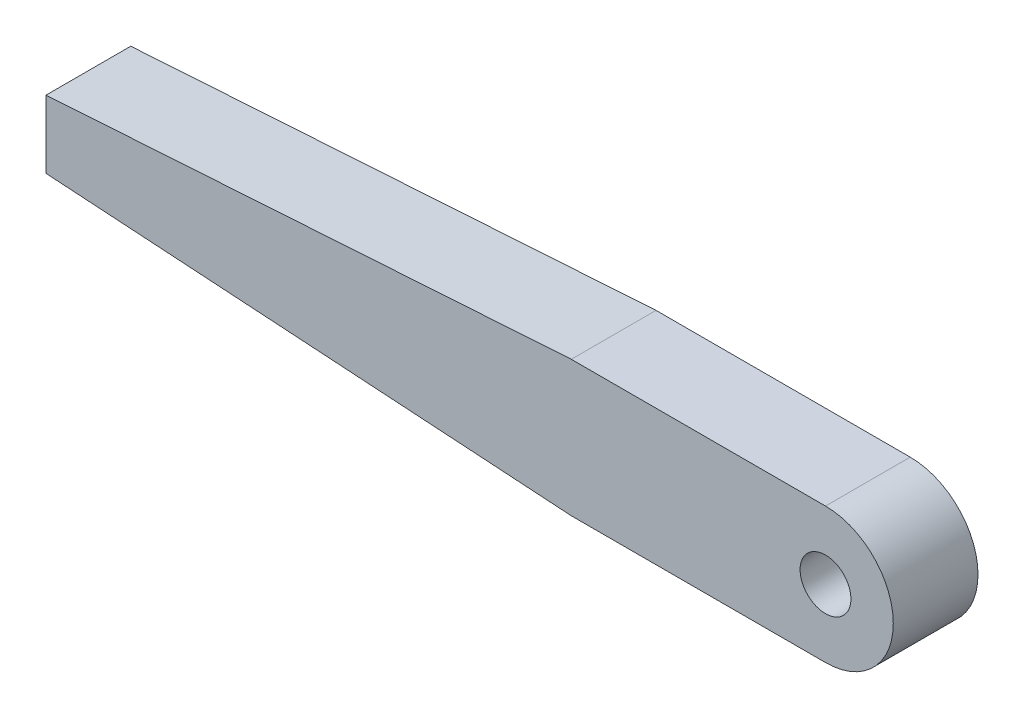
ISO-10303-21;
HEADER;
FILE_DESCRIPTION(('STEP AP214'),'2;1');
FILE_NAME('part.step','',(''),(''),'','','');
FILE_SCHEMA(('AUTOMOTIVE_DESIGN { 1 0 10303 214 1 1 1 1 }'));
ENDSEC;
DATA;
#1=APPLICATION_CONTEXT('core data for automotive mechanical design processes');
#2=APPLICATION_PROTOCOL_DEFINITION('international standard','automotive_design',2000,#1);
#3=PRODUCT_CONTEXT('',#1,'mechanical');
#4=PRODUCT('Part','Part','',(#3));
#5=PRODUCT_RELATED_PRODUCT_CATEGORY('part','',(#4));
#6=PRODUCT_DEFINITION_FORMATION('','',#4);
#7=PRODUCT_DEFINITION_CONTEXT('part definition',#1,'design');
#8=PRODUCT_DEFINITION('design','',#6,#7);
#9=PRODUCT_DEFINITION_SHAPE('','',#8);
#10=(LENGTH_UNIT() NAMED_UNIT(*) SI_UNIT(.MILLI.,.METRE.));
#11=(NAMED_UNIT(*) PLANE_ANGLE_UNIT() SI_UNIT($,.RADIAN.));
#12=(NAMED_UNIT(*) SI_UNIT($,.STERADIAN.) SOLID_ANGLE_UNIT());
#13=UNCERTAINTY_MEASURE_WITH_UNIT(LENGTH_MEASURE(1.E-05),#10,'distance_accuracy_value','');
#14=(GEOMETRIC_REPRESENTATION_CONTEXT(3) GLOBAL_UNCERTAINTY_ASSIGNED_CONTEXT((#13)) GLOBAL_UNIT_ASSIGNED_CONTEXT((#10,
#11,#12)) REPRESENTATION_CONTEXT('',''));
#15=CARTESIAN_POINT('',(0.,0.,0.));
#16=DIRECTION('',(0.,0.,1.));
#17=DIRECTION('',(1.,0.,0.));
#18=AXIS2_PLACEMENT_3D('',#15,#16,#17);
#19=CARTESIAN_POINT('',(21.,0.,5.));
#20=DIRECTION('',(0.,0.,-1.));
#21=DIRECTION('',(-1.,0.,0.));
#22=AXIS2_PLACEMENT_3D('',#19,#20,#21);
#23=PLANE('',#22);
#24=DIRECTION('',(-0.997925308968458,-0.064382277997965,0.));
#25=VECTOR('',#24,1.);
#26=CARTESIAN_POINT('',(6.,4.,5.));
#27=LINE('',#26,#25);
#28=CARTESIAN_POINT('',(6.,4.,5.));
#29=VERTEX_POINT('',#28);
#30=CARTESIAN_POINT('',(-25.,2.,5.));
#31=VERTEX_POINT('',#30);
#32=EDGE_CURVE('E130',#29,#31,#27,.T.);
#33=ORIENTED_EDGE('',*,*,#32,.T.);
#34=DIRECTION('',(0.,-1.,0.));
#35=VECTOR('',#34,1.);
#36=CARTESIAN_POINT('',(-25.,2.,5.));
#37=LINE('',#36,#35);
#38=CARTESIAN_POINT('',(-25.,-2.,5.));
#39=VERTEX_POINT('',#38);
#40=EDGE_CURVE('E88',#31,#39,#37,.T.);
#41=ORIENTED_EDGE('',*,*,#40,.T.);
#42=DIRECTION('',(0.997925308968458,-0.064382277997965,0.));
#43=VECTOR('',#42,1.);
#44=CARTESIAN_POINT('',(6.,-4.,5.));
#45=LINE('',#44,#43);
#46=CARTESIAN_POINT('',(6.,-4.,5.));
#47=VERTEX_POINT('',#46);
#48=EDGE_CURVE('E101',#39,#47,#45,.T.);
#49=ORIENTED_EDGE('',*,*,#48,.T.);
#50=DIRECTION('',(1.,0.,0.));
#51=VECTOR('',#50,1.);
#52=CARTESIAN_POINT('',(6.,-4.,5.));
#53=LINE('',#52,#51);
#54=CARTESIAN_POINT('',(21.,-4.,5.));
#55=VERTEX_POINT('',#54);
#56=EDGE_CURVE('E95',#47,#55,#53,.T.);
#57=ORIENTED_EDGE('',*,*,#56,.T.);
#58=CARTESIAN_POINT('',(21.,0.,5.));
#59=DIRECTION('',(0.,0.,1.));
#60=DIRECTION('',(-1.,0.,0.));
#61=AXIS2_PLACEMENT_3D('',#58,#59,#60);
#62=CIRCLE('',#61,4.);
#63=CARTESIAN_POINT('',(21.,4.,5.));
#64=VERTEX_POINT('',#63);
#65=EDGE_CURVE('E99',#55,#64,#62,.T.);
#66=ORIENTED_EDGE('',*,*,#65,.T.);
#67=DIRECTION('',(-1.,0.,0.));
#68=VECTOR('',#67,1.);
#69=CARTESIAN_POINT('',(6.,4.,5.));
#70=LINE('',#69,#68);
#71=EDGE_CURVE('E51',#64,#29,#70,.T.);
#72=ORIENTED_EDGE('',*,*,#71,.T.);
#73=EDGE_LOOP('',(#33,#41,#49,#57,#66,#72));
#74=FACE_BOUND('',#73,.T.);
#75=CARTESIAN_POINT('',(21.,0.,5.));
#76=DIRECTION('',(0.,0.,1.));
#77=DIRECTION('',(1.,0.,0.));
#78=AXIS2_PLACEMENT_3D('',#75,#76,#77);
#79=CIRCLE('',#78,1.5);
#80=CARTESIAN_POINT('',(22.5,0.,5.));
#81=VERTEX_POINT('',#80);
#82=EDGE_CURVE('E123',#81,#81,#79,.T.);
#83=ORIENTED_EDGE('',*,*,#82,.F.);
#84=EDGE_LOOP('',(#83));
#85=FACE_BOUND('',#84,.T.);
#86=ADVANCED_FACE('F34',(#74,#85),#23,.F.);
#87=CARTESIAN_POINT('',(21.,0.,0.));
#88=DIRECTION('',(0.,0.,-1.));
#89=DIRECTION('',(-1.,0.,0.));
#90=AXIS2_PLACEMENT_3D('',#87,#88,#89);
#91=PLANE('',#90);
#92=DIRECTION('',(-0.997925308968458,-0.064382277997965,0.));
#93=VECTOR('',#92,1.);
#94=CARTESIAN_POINT('',(6.,4.,0.));
#95=LINE('',#94,#93);
#96=CARTESIAN_POINT('',(6.,4.,0.));
#97=VERTEX_POINT('',#96);
#98=CARTESIAN_POINT('',(-25.,2.,0.));
#99=VERTEX_POINT('',#98);
#100=EDGE_CURVE('E119',#97,#99,#95,.T.);
#101=ORIENTED_EDGE('',*,*,#100,.F.);
#102=DIRECTION('',(-1.,0.,0.));
#103=VECTOR('',#102,1.);
#104=CARTESIAN_POINT('',(6.,4.,0.));
#105=LINE('',#104,#103);
#106=CARTESIAN_POINT('',(21.,4.,0.));
#107=VERTEX_POINT('',#106);
#108=EDGE_CURVE('E80',#107,#97,#105,.T.);
#109=ORIENTED_EDGE('',*,*,#108,.F.);
#110=CARTESIAN_POINT('',(21.,0.,0.));
#111=DIRECTION('',(0.,0.,1.));
#112=DIRECTION('',(-1.,0.,0.));
#113=AXIS2_PLACEMENT_3D('',#110,#111,#112);
#114=CIRCLE('',#113,4.);
#115=CARTESIAN_POINT('',(21.,-4.,0.));
#116=VERTEX_POINT('',#115);
#117=EDGE_CURVE('E74',#116,#107,#114,.T.);
#118=ORIENTED_EDGE('',*,*,#117,.F.);
#119=DIRECTION('',(1.,0.,0.));
#120=VECTOR('',#119,1.);
#121=CARTESIAN_POINT('',(6.,-4.,0.));
#122=LINE('',#121,#120);
#123=CARTESIAN_POINT('',(6.,-4.,0.));
#124=VERTEX_POINT('',#123);
#125=EDGE_CURVE('E109',#124,#116,#122,.T.);
#126=ORIENTED_EDGE('',*,*,#125,.F.);
#127=DIRECTION('',(0.997925308968458,-0.064382277997965,0.));
#128=VECTOR('',#127,1.);
#129=CARTESIAN_POINT('',(6.,-4.,0.));
#130=LINE('',#129,#128);
#131=CARTESIAN_POINT('',(-25.,-2.,0.));
#132=VERTEX_POINT('',#131);
#133=EDGE_CURVE('E125',#132,#124,#130,.T.);
#134=ORIENTED_EDGE('',*,*,#133,.F.);
#135=DIRECTION('',(0.,-1.,0.));
#136=VECTOR('',#135,1.);
#137=CARTESIAN_POINT('',(-25.,2.,0.));
#138=LINE('',#137,#136);
#139=EDGE_CURVE('E122',#99,#132,#138,.T.);
#140=ORIENTED_EDGE('',*,*,#139,.F.);
#141=EDGE_LOOP('',(#101,#109,#118,#126,#134,#140));
#142=FACE_BOUND('',#141,.T.);
#143=CARTESIAN_POINT('',(21.,0.,0.));
#144=DIRECTION('',(0.,0.,1.));
#145=DIRECTION('',(1.,0.,0.));
#146=AXIS2_PLACEMENT_3D('',#143,#144,#145);
#147=CIRCLE('',#146,1.5);
#148=CARTESIAN_POINT('',(22.5,0.,0.));
#149=VERTEX_POINT('',#148);
#150=EDGE_CURVE('E223',#149,#149,#147,.T.);
#151=ORIENTED_EDGE('',*,*,#150,.T.);
#152=EDGE_LOOP('',(#151));
#153=FACE_BOUND('',#152,.T.);
#154=ADVANCED_FACE('F139',(#142,#153),#91,.T.);
#155=CARTESIAN_POINT('',(6.,4.,5.));
#156=DIRECTION('',(0.064382277997965,-0.997925308968458,0.));
#157=DIRECTION('',(0.997925308968458,0.064382277997965,0.));
#158=AXIS2_PLACEMENT_3D('',#155,#156,#157);
#159=PLANE('',#158);
#160=ORIENTED_EDGE('',*,*,#100,.T.);
#161=DIRECTION('',(0.,0.,-1.));
#162=VECTOR('',#161,1.);
#163=CARTESIAN_POINT('',(-25.,2.,5.));
#164=LINE('',#163,#162);
#165=EDGE_CURVE('E11',#31,#99,#164,.T.);
#166=ORIENTED_EDGE('',*,*,#165,.F.);
#167=ORIENTED_EDGE('',*,*,#32,.F.);
#168=DIRECTION('',(0.,0.,-1.));
#169=VECTOR('',#168,1.);
#170=CARTESIAN_POINT('',(6.,4.,5.));
#171=LINE('',#170,#169);
#172=EDGE_CURVE('E115',#29,#97,#171,.T.);
#173=ORIENTED_EDGE('',*,*,#172,.T.);
#174=EDGE_LOOP('',(#160,#166,#167,#173));
#175=FACE_BOUND('',#174,.T.);
#176=ADVANCED_FACE('F36',(#175),#159,.F.);
#177=CARTESIAN_POINT('',(-25.,2.,5.));
#178=DIRECTION('',(1.,0.,0.));
#179=DIRECTION('',(0.,0.,-1.));
#180=AXIS2_PLACEMENT_3D('',#177,#178,#179);
#181=PLANE('',#180);
#182=ORIENTED_EDGE('',*,*,#139,.T.);
#183=DIRECTION('',(0.,0.,-1.));
#184=VECTOR('',#183,1.);
#185=CARTESIAN_POINT('',(-25.,-2.,5.));
#186=LINE('',#185,#184);
#187=EDGE_CURVE('E43',#39,#132,#186,.T.);
#188=ORIENTED_EDGE('',*,*,#187,.F.);
#189=ORIENTED_EDGE('',*,*,#40,.F.);
#190=ORIENTED_EDGE('',*,*,#165,.T.);
#191=EDGE_LOOP('',(#182,#188,#189,#190));
#192=FACE_BOUND('',#191,.T.);
#193=ADVANCED_FACE('F164',(#192),#181,.F.);
#194=CARTESIAN_POINT('',(6.,-4.,5.));
#195=DIRECTION('',(0.064382277997965,0.997925308968458,0.));
#196=DIRECTION('',(-0.997925308968458,0.064382277997965,0.));
#197=AXIS2_PLACEMENT_3D('',#194,#195,#196);
#198=PLANE('',#197);
#199=ORIENTED_EDGE('',*,*,#133,.T.);
#200=DIRECTION('',(0.,0.,-1.));
#201=VECTOR('',#200,1.);
#202=CARTESIAN_POINT('',(6.,-4.,5.));
#203=LINE('',#202,#201);
#204=EDGE_CURVE('E110',#47,#124,#203,.T.);
#205=ORIENTED_EDGE('',*,*,#204,.F.);
#206=ORIENTED_EDGE('',*,*,#48,.F.);
#207=ORIENTED_EDGE('',*,*,#187,.T.);
#208=EDGE_LOOP('',(#199,#205,#206,#207));
#209=FACE_BOUND('',#208,.T.);
#210=ADVANCED_FACE('F136',(#209),#198,.F.);
#211=CARTESIAN_POINT('',(6.,-4.,5.));
#212=DIRECTION('',(0.,1.,0.));
#213=DIRECTION('',(0.,0.,1.));
#214=AXIS2_PLACEMENT_3D('',#211,#212,#213);
#215=PLANE('',#214);
#216=ORIENTED_EDGE('',*,*,#125,.T.);
#217=DIRECTION('',(0.,0.,-1.));
#218=VECTOR('',#217,1.);
#219=CARTESIAN_POINT('',(21.,-4.,5.));
#220=LINE('',#219,#218);
#221=EDGE_CURVE('E106',#55,#116,#220,.T.);
#222=ORIENTED_EDGE('',*,*,#221,.F.);
#223=ORIENTED_EDGE('',*,*,#56,.F.);
#224=ORIENTED_EDGE('',*,*,#204,.T.);
#225=EDGE_LOOP('',(#216,#222,#223,#224));
#226=FACE_BOUND('',#225,.T.);
#227=ADVANCED_FACE('F107',(#226),#215,.F.);
#228=CARTESIAN_POINT('',(21.,0.,5.));
#229=DIRECTION('',(0.,0.,-1.));
#230=DIRECTION('',(-1.,0.,0.));
#231=AXIS2_PLACEMENT_3D('',#228,#229,#230);
#232=CYLINDRICAL_SURFACE('',#231,4.);
#233=ORIENTED_EDGE('',*,*,#117,.T.);
#234=DIRECTION('',(0.,0.,-1.));
#235=VECTOR('',#234,1.);
#236=CARTESIAN_POINT('',(21.,4.,5.));
#237=LINE('',#236,#235);
#238=EDGE_CURVE('E111',#64,#107,#237,.T.);
#239=ORIENTED_EDGE('',*,*,#238,.F.);
#240=ORIENTED_EDGE('',*,*,#65,.F.);
#241=ORIENTED_EDGE('',*,*,#221,.T.);
#242=EDGE_LOOP('',(#233,#239,#240,#241));
#243=FACE_BOUND('',#242,.T.);
#244=ADVANCED_FACE('F113',(#243),#232,.T.);
#245=CARTESIAN_POINT('',(6.,4.,5.));
#246=DIRECTION('',(0.,-1.,0.));
#247=DIRECTION('',(0.,0.,-1.));
#248=AXIS2_PLACEMENT_3D('',#245,#246,#247);
#249=PLANE('',#248);
#250=ORIENTED_EDGE('',*,*,#108,.T.);
#251=ORIENTED_EDGE('',*,*,#172,.F.);
#252=ORIENTED_EDGE('',*,*,#71,.F.);
#253=ORIENTED_EDGE('',*,*,#238,.T.);
#254=EDGE_LOOP('',(#250,#251,#252,#253));
#255=FACE_BOUND('',#254,.T.);
#256=ADVANCED_FACE('F144',(#255),#249,.F.);
#257=CARTESIAN_POINT('',(21.,0.,5.));
#258=DIRECTION('',(0.,0.,-1.));
#259=DIRECTION('',(-1.,0.,0.));
#260=AXIS2_PLACEMENT_3D('',#257,#258,#259);
#261=CYLINDRICAL_SURFACE('',#260,1.5);
#262=ORIENTED_EDGE('',*,*,#82,.T.);
#263=EDGE_LOOP('',(#262));
#264=FACE_BOUND('',#263,.T.);
#265=ORIENTED_EDGE('',*,*,#150,.F.);
#266=EDGE_LOOP('',(#265));
#267=FACE_BOUND('',#266,.T.);
#268=ADVANCED_FACE('F146',(#264,#267),#261,.F.);
#269=CLOSED_SHELL('',(#86,#154,#176,#193,#210,#227,#244,#256,#268));
#270=MANIFOLD_SOLID_BREP('B2',#269);
#271=ADVANCED_BREP_SHAPE_REPRESENTATION('',(#18,#270),#14);
#272=SHAPE_DEFINITION_REPRESENTATION(#9,#271);
ENDSEC;
END-ISO-10303-21;
